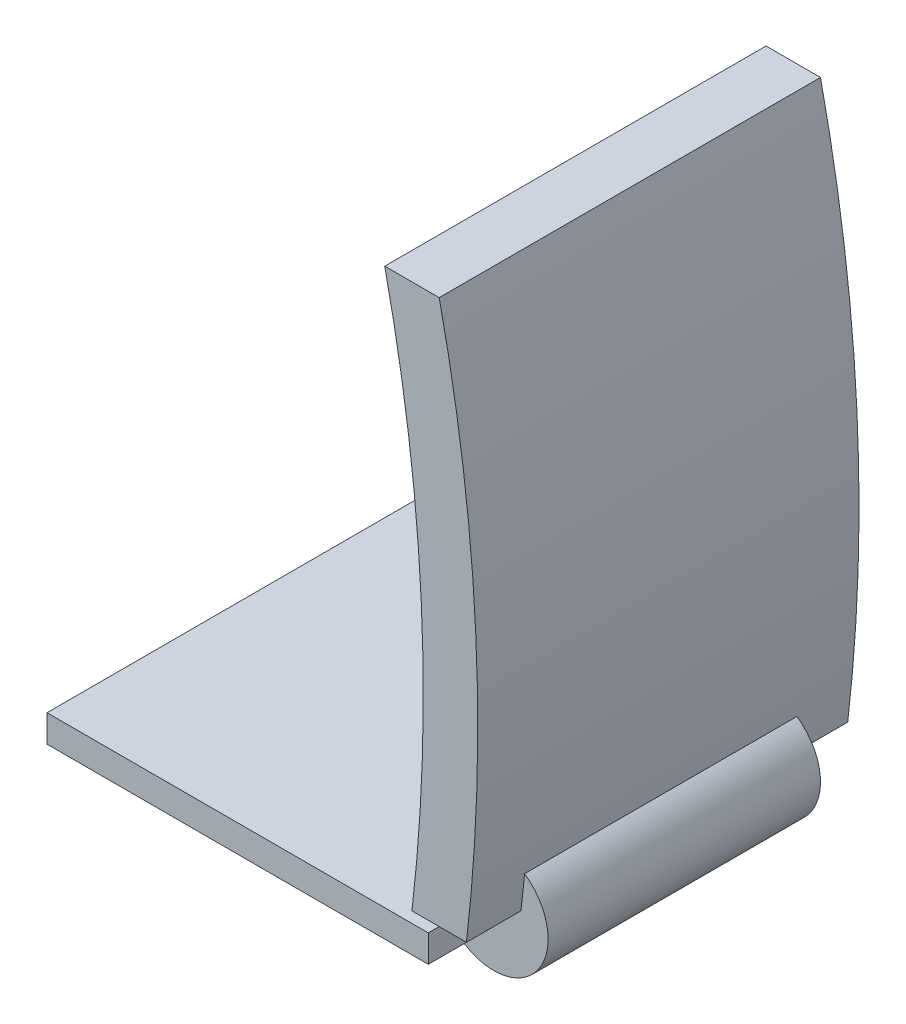
ISO-10303-21;
HEADER;
FILE_DESCRIPTION(('STEP AP214'),'2;1');
FILE_NAME('part.step','',(''),(''),'','','');
FILE_SCHEMA(('AUTOMOTIVE_DESIGN { 1 0 10303 214 1 1 1 1 }'));
ENDSEC;
DATA;
#1=APPLICATION_CONTEXT('core data for automotive mechanical design processes');
#2=APPLICATION_PROTOCOL_DEFINITION('international standard','automotive_design',2000,#1);
#3=PRODUCT_CONTEXT('',#1,'mechanical');
#4=PRODUCT('Part','Part','',(#3));
#5=PRODUCT_RELATED_PRODUCT_CATEGORY('part','',(#4));
#6=PRODUCT_DEFINITION_FORMATION('','',#4);
#7=PRODUCT_DEFINITION_CONTEXT('part definition',#1,'design');
#8=PRODUCT_DEFINITION('design','',#6,#7);
#9=PRODUCT_DEFINITION_SHAPE('','',#8);
#10=(LENGTH_UNIT() NAMED_UNIT(*) SI_UNIT(.MILLI.,.METRE.));
#11=(NAMED_UNIT(*) PLANE_ANGLE_UNIT() SI_UNIT($,.RADIAN.));
#12=(NAMED_UNIT(*) SI_UNIT($,.STERADIAN.) SOLID_ANGLE_UNIT());
#13=UNCERTAINTY_MEASURE_WITH_UNIT(LENGTH_MEASURE(1.E-05),#10,'distance_accuracy_value','');
#14=(GEOMETRIC_REPRESENTATION_CONTEXT(3) GLOBAL_UNCERTAINTY_ASSIGNED_CONTEXT((#13)) GLOBAL_UNIT_ASSIGNED_CONTEXT((#10,
#11,#12)) REPRESENTATION_CONTEXT('',''));
#15=CARTESIAN_POINT('',(0.,0.,0.));
#16=DIRECTION('',(0.,0.,1.));
#17=DIRECTION('',(1.,0.,0.));
#18=AXIS2_PLACEMENT_3D('',#15,#16,#17);
#19=CARTESIAN_POINT('',(-20.,0.,-350.));
#20=DIRECTION('',(-1.,0.,0.));
#21=DIRECTION('',(0.,-1.,0.));
#22=AXIS2_PLACEMENT_3D('',#19,#20,#21);
#23=PLANE('',#22);
#24=DIRECTION('',(0.,-1.,0.));
#25=VECTOR('',#24,1.);
#26=CARTESIAN_POINT('',(-20.,0.,-250.));
#27=LINE('',#26,#25);
#28=CARTESIAN_POINT('',(-20.,0.,-250.));
#29=VERTEX_POINT('',#28);
#30=CARTESIAN_POINT('',(-20.,-50.,-250.));
#31=VERTEX_POINT('',#30);
#32=EDGE_CURVE('E254',#29,#31,#27,.T.);
#33=ORIENTED_EDGE('',*,*,#32,.T.);
#34=DIRECTION('',(0.,0.,1.));
#35=VECTOR('',#34,1.);
#36=CARTESIAN_POINT('',(-20.,-50.,-350.));
#37=LINE('',#36,#35);
#38=CARTESIAN_POINT('',(-20.,-50.,-350.));
#39=VERTEX_POINT('',#38);
#40=EDGE_CURVE('E38',#39,#31,#37,.T.);
#41=ORIENTED_EDGE('',*,*,#40,.F.);
#42=DIRECTION('',(0.,-1.,0.));
#43=VECTOR('',#42,1.);
#44=CARTESIAN_POINT('',(-20.,0.,-350.));
#45=LINE('',#44,#43);
#46=CARTESIAN_POINT('',(-20.,0.,-350.));
#47=VERTEX_POINT('',#46);
#48=EDGE_CURVE('E274',#47,#39,#45,.T.);
#49=ORIENTED_EDGE('',*,*,#48,.F.);
#50=DIRECTION('',(0.,0.,1.));
#51=VECTOR('',#50,1.);
#52=CARTESIAN_POINT('',(-20.,0.,-350.));
#53=LINE('',#52,#51);
#54=EDGE_CURVE('E156',#47,#29,#53,.T.);
#55=ORIENTED_EDGE('',*,*,#54,.T.);
#56=EDGE_LOOP('',(#33,#41,#49,#55));
#57=FACE_BOUND('',#56,.T.);
#58=ADVANCED_FACE('F34',(#57),#23,.F.);
#59=CARTESIAN_POINT('',(0.,-50.,-350.));
#60=DIRECTION('',(0.,1.,0.));
#61=DIRECTION('',(-1.,0.,0.));
#62=AXIS2_PLACEMENT_3D('',#59,#60,#61);
#63=PLANE('',#62);
#64=CARTESIAN_POINT('',(-370.,-50.,0.));
#65=DIRECTION('',(0.,-1.,0.));
#66=DIRECTION('',(1.,0.,0.));
#67=AXIS2_PLACEMENT_3D('',#64,#65,#66);
#68=CIRCLE('',#67,100.);
#69=CARTESIAN_POINT('',(-270.,-50.,0.));
#70=VERTEX_POINT('',#69);
#71=EDGE_CURVE('E172',#70,#70,#68,.T.);
#72=ORIENTED_EDGE('',*,*,#71,.F.);
#73=EDGE_LOOP('',(#72));
#74=FACE_BOUND('',#73,.T.);
#75=DIRECTION('',(-1.,0.,0.));
#76=VECTOR('',#75,1.);
#77=CARTESIAN_POINT('',(0.,-50.,-250.));
#78=LINE('',#77,#76);
#79=CARTESIAN_POINT('',(-86.6025403784439,-50.,-250.));
#80=VERTEX_POINT('',#79);
#81=EDGE_CURVE('E257',#31,#80,#78,.T.);
#82=ORIENTED_EDGE('',*,*,#81,.T.);
#83=DIRECTION('',(0.,0.,1.));
#84=VECTOR('',#83,1.);
#85=CARTESIAN_POINT('',(-86.6025403784439,-50.,-250.));
#86=LINE('',#85,#84);
#87=CARTESIAN_POINT('',(-86.6025403784439,-50.,250.));
#88=VERTEX_POINT('',#87);
#89=EDGE_CURVE('E268',#80,#88,#86,.T.);
#90=ORIENTED_EDGE('',*,*,#89,.T.);
#91=DIRECTION('',(-1.,0.,0.));
#92=VECTOR('',#91,1.);
#93=CARTESIAN_POINT('',(0.,-50.,250.));
#94=LINE('',#93,#92);
#95=CARTESIAN_POINT('',(-20.,-50.,250.));
#96=VERTEX_POINT('',#95);
#97=EDGE_CURVE('E214',#96,#88,#94,.T.);
#98=ORIENTED_EDGE('',*,*,#97,.F.);
#99=DIRECTION('',(0.,0.,-1.));
#100=VECTOR('',#99,1.);
#101=CARTESIAN_POINT('',(-20.,-50.,350.));
#102=LINE('',#101,#100);
#103=CARTESIAN_POINT('',(-20.,-50.,350.));
#104=VERTEX_POINT('',#103);
#105=EDGE_CURVE('E180',#104,#96,#102,.T.);
#106=ORIENTED_EDGE('',*,*,#105,.F.);
#107=DIRECTION('',(-1.,0.,0.));
#108=VECTOR('',#107,1.);
#109=CARTESIAN_POINT('',(0.,-50.,350.));
#110=LINE('',#109,#108);
#111=CARTESIAN_POINT('',(-720.,-50.0000000000001,350.));
#112=VERTEX_POINT('',#111);
#113=EDGE_CURVE('E164',#104,#112,#110,.T.);
#114=ORIENTED_EDGE('',*,*,#113,.T.);
#115=DIRECTION('',(0.,0.,1.));
#116=VECTOR('',#115,1.);
#117=CARTESIAN_POINT('',(-720.,-50.0000000000001,-350.));
#118=LINE('',#117,#116);
#119=CARTESIAN_POINT('',(-720.,-50.0000000000001,-350.));
#120=VERTEX_POINT('',#119);
#121=EDGE_CURVE('E11',#120,#112,#118,.T.);
#122=ORIENTED_EDGE('',*,*,#121,.F.);
#123=DIRECTION('',(-1.,0.,0.));
#124=VECTOR('',#123,1.);
#125=CARTESIAN_POINT('',(0.,-50.,-350.));
#126=LINE('',#125,#124);
#127=EDGE_CURVE('E51',#39,#120,#126,.T.);
#128=ORIENTED_EDGE('',*,*,#127,.F.);
#129=ORIENTED_EDGE('',*,*,#40,.T.);
#130=EDGE_LOOP('',(#82,#90,#98,#106,#114,#122,#128,#129));
#131=FACE_BOUND('',#130,.T.);
#132=ADVANCED_FACE('F36',(#74,#131),#63,.F.);
#133=CARTESIAN_POINT('',(-720.,0.,-350.));
#134=DIRECTION('',(-1.,0.,0.));
#135=DIRECTION('',(0.,0.,1.));
#136=AXIS2_PLACEMENT_3D('',#133,#134,#135);
#137=PLANE('',#136);
#138=ORIENTED_EDGE('',*,*,#121,.T.);
#139=DIRECTION('',(0.,-1.,0.));
#140=VECTOR('',#139,1.);
#141=CARTESIAN_POINT('',(-720.,0.,350.));
#142=LINE('',#141,#140);
#143=CARTESIAN_POINT('',(-720.,0.,350.));
#144=VERTEX_POINT('',#143);
#145=EDGE_CURVE('E159',#144,#112,#142,.T.);
#146=ORIENTED_EDGE('',*,*,#145,.F.);
#147=DIRECTION('',(0.,0.,1.));
#148=VECTOR('',#147,1.);
#149=CARTESIAN_POINT('',(-720.,0.,-350.));
#150=LINE('',#149,#148);
#151=CARTESIAN_POINT('',(-720.,0.,-350.));
#152=VERTEX_POINT('',#151);
#153=EDGE_CURVE('E43',#152,#144,#150,.T.);
#154=ORIENTED_EDGE('',*,*,#153,.F.);
#155=DIRECTION('',(0.,-1.,0.));
#156=VECTOR('',#155,1.);
#157=CARTESIAN_POINT('',(-720.,0.,-350.));
#158=LINE('',#157,#156);
#159=EDGE_CURVE('E277',#152,#120,#158,.T.);
#160=ORIENTED_EDGE('',*,*,#159,.T.);
#161=EDGE_LOOP('',(#138,#146,#154,#160));
#162=FACE_BOUND('',#161,.T.);
#163=ADVANCED_FACE('F160',(#162),#137,.T.);
#164=CARTESIAN_POINT('',(0.,0.,-350.));
#165=DIRECTION('',(0.,1.,0.));
#166=DIRECTION('',(-1.,0.,0.));
#167=AXIS2_PLACEMENT_3D('',#164,#165,#166);
#168=PLANE('',#167);
#169=DIRECTION('',(0.,0.,1.));
#170=VECTOR('',#169,1.);
#171=CARTESIAN_POINT('',(-100.,0.,-250.));
#172=LINE('',#171,#170);
#173=CARTESIAN_POINT('',(-100.,0.,-250.));
#174=VERTEX_POINT('',#173);
#175=CARTESIAN_POINT('',(-100.,0.,250.));
#176=VERTEX_POINT('',#175);
#177=EDGE_CURVE('E270',#174,#176,#172,.T.);
#178=ORIENTED_EDGE('',*,*,#177,.F.);
#179=DIRECTION('',(-1.,0.,0.));
#180=VECTOR('',#179,1.);
#181=CARTESIAN_POINT('',(0.,0.,-250.));
#182=LINE('',#181,#180);
#183=EDGE_CURVE('E252',#29,#174,#182,.T.);
#184=ORIENTED_EDGE('',*,*,#183,.F.);
#185=ORIENTED_EDGE('',*,*,#54,.F.);
#186=DIRECTION('',(-1.,0.,0.));
#187=VECTOR('',#186,1.);
#188=CARTESIAN_POINT('',(0.,0.,-350.));
#189=LINE('',#188,#187);
#190=EDGE_CURVE('E155',#47,#152,#189,.T.);
#191=ORIENTED_EDGE('',*,*,#190,.T.);
#192=ORIENTED_EDGE('',*,*,#153,.T.);
#193=DIRECTION('',(-1.,0.,0.));
#194=VECTOR('',#193,1.);
#195=CARTESIAN_POINT('',(0.,0.,350.));
#196=LINE('',#195,#194);
#197=CARTESIAN_POINT('',(-20.,0.,350.));
#198=VERTEX_POINT('',#197);
#199=EDGE_CURVE('E152',#198,#144,#196,.T.);
#200=ORIENTED_EDGE('',*,*,#199,.F.);
#201=DIRECTION('',(0.,0.,-1.));
#202=VECTOR('',#201,1.);
#203=CARTESIAN_POINT('',(-20.,0.,350.));
#204=LINE('',#203,#202);
#205=CARTESIAN_POINT('',(-20.,0.,250.));
#206=VERTEX_POINT('',#205);
#207=EDGE_CURVE('E178',#198,#206,#204,.T.);
#208=ORIENTED_EDGE('',*,*,#207,.T.);
#209=DIRECTION('',(-1.,0.,0.));
#210=VECTOR('',#209,1.);
#211=CARTESIAN_POINT('',(0.,0.,250.));
#212=LINE('',#211,#210);
#213=EDGE_CURVE('E208',#206,#176,#212,.T.);
#214=ORIENTED_EDGE('',*,*,#213,.T.);
#215=EDGE_LOOP('',(#178,#184,#185,#191,#192,#200,#208,#214));
#216=FACE_BOUND('',#215,.T.);
#217=ADVANCED_FACE('F149',(#216),#168,.T.);
#218=CARTESIAN_POINT('',(0.,0.,-350.));
#219=DIRECTION('',(0.,0.,1.));
#220=DIRECTION('',(1.,0.,0.));
#221=AXIS2_PLACEMENT_3D('',#218,#219,#220);
#222=PLANE('',#221);
#223=ORIENTED_EDGE('',*,*,#127,.T.);
#224=ORIENTED_EDGE('',*,*,#159,.F.);
#225=ORIENTED_EDGE('',*,*,#190,.F.);
#226=ORIENTED_EDGE('',*,*,#48,.T.);
#227=EDGE_LOOP('',(#223,#224,#225,#226));
#228=FACE_BOUND('',#227,.T.);
#229=ADVANCED_FACE('F318',(#228),#222,.F.);
#230=CARTESIAN_POINT('',(0.,0.,-250.));
#231=DIRECTION('',(0.,0.,1.));
#232=DIRECTION('',(1.,0.,0.));
#233=AXIS2_PLACEMENT_3D('',#230,#231,#232);
#234=CYLINDRICAL_SURFACE('',#233,100.);
#235=DIRECTION('',(0.,0.,1.));
#236=VECTOR('',#235,1.);
#237=CARTESIAN_POINT('',(56.7139128609186,82.3622006020113,-250.));
#238=LINE('',#237,#236);
#239=CARTESIAN_POINT('',(56.7139128609186,82.3622006020113,-250.));
#240=VERTEX_POINT('',#239);
#241=CARTESIAN_POINT('',(56.7139128609175,82.3622006020011,250.));
#242=VERTEX_POINT('',#241);
#243=EDGE_CURVE('E266',#240,#242,#238,.T.);
#244=ORIENTED_EDGE('',*,*,#243,.T.);
#245=CARTESIAN_POINT('',(0.,0.,250.));
#246=DIRECTION('',(0.,0.,1.));
#247=DIRECTION('',(1.,0.,0.));
#248=AXIS2_PLACEMENT_3D('',#245,#246,#247);
#249=CIRCLE('',#248,100.);
#250=EDGE_CURVE('E217',#88,#242,#249,.T.);
#251=ORIENTED_EDGE('',*,*,#250,.F.);
#252=ORIENTED_EDGE('',*,*,#89,.F.);
#253=CARTESIAN_POINT('',(0.,0.,-250.));
#254=DIRECTION('',(0.,0.,1.));
#255=DIRECTION('',(1.,0.,0.));
#256=AXIS2_PLACEMENT_3D('',#253,#254,#255);
#257=CIRCLE('',#256,100.);
#258=EDGE_CURVE('E260',#80,#240,#257,.T.);
#259=ORIENTED_EDGE('',*,*,#258,.T.);
#260=EDGE_LOOP('',(#244,#251,#252,#259));
#261=FACE_BOUND('',#260,.T.);
#262=ADVANCED_FACE('F311',(#261),#234,.T.);
#263=CARTESIAN_POINT('',(0.,0.,-250.));
#264=DIRECTION('',(0.,0.,1.));
#265=DIRECTION('',(1.,0.,0.));
#266=AXIS2_PLACEMENT_3D('',#263,#264,#265);
#267=CYLINDRICAL_SURFACE('',#266,100.);
#268=ORIENTED_EDGE('',*,*,#177,.T.);
#269=CARTESIAN_POINT('',(0.,0.,250.));
#270=DIRECTION('',(0.,0.,1.));
#271=DIRECTION('',(1.,0.,0.));
#272=AXIS2_PLACEMENT_3D('',#269,#270,#271);
#273=CIRCLE('',#272,100.);
#274=CARTESIAN_POINT('',(-42.5055489531823,90.5167294382122,250.));
#275=VERTEX_POINT('',#274);
#276=EDGE_CURVE('E205',#275,#176,#273,.T.);
#277=ORIENTED_EDGE('',*,*,#276,.F.);
#278=DIRECTION('',(0.,0.,1.));
#279=VECTOR('',#278,1.);
#280=CARTESIAN_POINT('',(-42.5055489531823,90.5167294382122,-250.));
#281=LINE('',#280,#279);
#282=CARTESIAN_POINT('',(-42.5055489531834,90.5167294382013,-250.));
#283=VERTEX_POINT('',#282);
#284=EDGE_CURVE('E265',#283,#275,#281,.T.);
#285=ORIENTED_EDGE('',*,*,#284,.F.);
#286=CARTESIAN_POINT('',(0.,0.,-250.));
#287=DIRECTION('',(0.,0.,1.));
#288=DIRECTION('',(1.,0.,0.));
#289=AXIS2_PLACEMENT_3D('',#286,#287,#288);
#290=CIRCLE('',#289,100.);
#291=EDGE_CURVE('E249',#283,#174,#290,.T.);
#292=ORIENTED_EDGE('',*,*,#291,.T.);
#293=EDGE_LOOP('',(#268,#277,#285,#292));
#294=FACE_BOUND('',#293,.T.);
#295=ADVANCED_FACE('F291',(#294),#267,.T.);
#296=CARTESIAN_POINT('',(0.,0.,-250.));
#297=DIRECTION('',(0.,0.,1.));
#298=DIRECTION('',(1.,0.,0.));
#299=AXIS2_PLACEMENT_3D('',#296,#297,#298);
#300=PLANE('',#299);
#301=DIRECTION('',(-1.,0.,0.));
#302=VECTOR('',#301,1.);
#303=CARTESIAN_POINT('',(0.,20.,-250.));
#304=LINE('',#303,#302);
#305=CARTESIAN_POINT('',(50.,20.,-250.));
#306=VERTEX_POINT('',#305);
#307=CARTESIAN_POINT('',(-50.,20.,-250.));
#308=VERTEX_POINT('',#307);
#309=EDGE_CURVE('E243',#306,#308,#304,.T.);
#310=ORIENTED_EDGE('',*,*,#309,.F.);
#311=CARTESIAN_POINT('',(-2929.24374582154,372.287812708923,-250.));
#312=DIRECTION('',(0.,0.,1.));
#313=DIRECTION('',(1.,0.,0.));
#314=AXIS2_PLACEMENT_3D('',#311,#312,#313);
#315=CIRCLE('',#314,3000.);
#316=EDGE_CURVE('E263',#306,#240,#315,.T.);
#317=ORIENTED_EDGE('',*,*,#316,.T.);
#318=ORIENTED_EDGE('',*,*,#258,.F.);
#319=ORIENTED_EDGE('',*,*,#81,.F.);
#320=ORIENTED_EDGE('',*,*,#32,.F.);
#321=ORIENTED_EDGE('',*,*,#183,.T.);
#322=ORIENTED_EDGE('',*,*,#291,.F.);
#323=CARTESIAN_POINT('',(-3029.24374582154,372.287812708923,-250.));
#324=DIRECTION('',(0.,0.,1.));
#325=DIRECTION('',(1.,0.,0.));
#326=AXIS2_PLACEMENT_3D('',#323,#324,#325);
#327=CIRCLE('',#326,3000.);
#328=EDGE_CURVE('E246',#308,#283,#327,.T.);
#329=ORIENTED_EDGE('',*,*,#328,.F.);
#330=EDGE_LOOP('',(#310,#317,#318,#319,#320,#321,#322,#329));
#331=FACE_BOUND('',#330,.T.);
#332=ADVANCED_FACE('F286',(#331),#300,.F.);
#333=CARTESIAN_POINT('',(50.,20.,-350.));
#334=DIRECTION('',(0.,1.,0.));
#335=DIRECTION('',(-1.,0.,0.));
#336=AXIS2_PLACEMENT_3D('',#333,#334,#335);
#337=PLANE('',#336);
#338=DIRECTION('',(0.,0.,1.));
#339=VECTOR('',#338,1.);
#340=CARTESIAN_POINT('',(50.,20.,-350.));
#341=LINE('',#340,#339);
#342=CARTESIAN_POINT('',(50.,20.,-350.));
#343=VERTEX_POINT('',#342);
#344=EDGE_CURVE('E223',#343,#306,#341,.T.);
#345=ORIENTED_EDGE('',*,*,#344,.T.);
#346=ORIENTED_EDGE('',*,*,#309,.T.);
#347=DIRECTION('',(0.,0.,1.));
#348=VECTOR('',#347,1.);
#349=CARTESIAN_POINT('',(-50.0000000000003,19.9999999999985,-350.));
#350=LINE('',#349,#348);
#351=CARTESIAN_POINT('',(-50.0000000000003,19.9999999999985,-350.));
#352=VERTEX_POINT('',#351);
#353=EDGE_CURVE('E229',#352,#308,#350,.T.);
#354=ORIENTED_EDGE('',*,*,#353,.F.);
#355=DIRECTION('',(-1.,0.,0.));
#356=VECTOR('',#355,1.);
#357=CARTESIAN_POINT('',(50.,20.,-350.));
#358=LINE('',#357,#356);
#359=EDGE_CURVE('E226',#343,#352,#358,.T.);
#360=ORIENTED_EDGE('',*,*,#359,.F.);
#361=EDGE_LOOP('',(#345,#346,#354,#360));
#362=FACE_BOUND('',#361,.T.);
#363=ADVANCED_FACE('F297',(#362),#337,.F.);
#364=CARTESIAN_POINT('',(-2929.24374582154,372.287812708923,-350.));
#365=DIRECTION('',(0.,0.,1.));
#366=DIRECTION('',(1.,0.,0.));
#367=AXIS2_PLACEMENT_3D('',#364,#365,#366);
#368=CYLINDRICAL_SURFACE('',#367,3000.);
#369=DIRECTION('',(0.,0.,1.));
#370=VECTOR('',#369,1.);
#371=CARTESIAN_POINT('',(0.,1020.,-350.));
#372=LINE('',#371,#370);
#373=CARTESIAN_POINT('',(0.,1020.,-350.));
#374=VERTEX_POINT('',#373);
#375=CARTESIAN_POINT('',(0.,1020.,350.));
#376=VERTEX_POINT('',#375);
#377=EDGE_CURVE('E224',#374,#376,#372,.T.);
#378=ORIENTED_EDGE('',*,*,#377,.T.);
#379=CARTESIAN_POINT('',(-2929.24374582154,372.287812708923,350.));
#380=DIRECTION('',(0.,0.,1.));
#381=DIRECTION('',(1.,0.,0.));
#382=AXIS2_PLACEMENT_3D('',#379,#380,#381);
#383=CIRCLE('',#382,3000.);
#384=CARTESIAN_POINT('',(50.,20.,350.));
#385=VERTEX_POINT('',#384);
#386=EDGE_CURVE('E188',#385,#376,#383,.T.);
#387=ORIENTED_EDGE('',*,*,#386,.F.);
#388=DIRECTION('',(0.,0.,-1.));
#389=VECTOR('',#388,1.);
#390=CARTESIAN_POINT('',(50.,20.,350.));
#391=LINE('',#390,#389);
#392=CARTESIAN_POINT('',(50.,20.,250.));
#393=VERTEX_POINT('',#392);
#394=EDGE_CURVE('E194',#385,#393,#391,.T.);
#395=ORIENTED_EDGE('',*,*,#394,.T.);
#396=CARTESIAN_POINT('',(-2929.24374582154,372.287812708923,250.));
#397=DIRECTION('',(0.,0.,1.));
#398=DIRECTION('',(1.,0.,0.));
#399=AXIS2_PLACEMENT_3D('',#396,#397,#398);
#400=CIRCLE('',#399,3000.);
#401=EDGE_CURVE('E220',#393,#242,#400,.T.);
#402=ORIENTED_EDGE('',*,*,#401,.T.);
#403=ORIENTED_EDGE('',*,*,#243,.F.);
#404=ORIENTED_EDGE('',*,*,#316,.F.);
#405=ORIENTED_EDGE('',*,*,#344,.F.);
#406=CARTESIAN_POINT('',(-2929.24374582154,372.287812708923,-350.));
#407=DIRECTION('',(0.,0.,1.));
#408=DIRECTION('',(1.,0.,0.));
#409=AXIS2_PLACEMENT_3D('',#406,#407,#408);
#410=CIRCLE('',#409,3000.);
#411=EDGE_CURVE('E240',#343,#374,#410,.T.);
#412=ORIENTED_EDGE('',*,*,#411,.T.);
#413=EDGE_LOOP('',(#378,#387,#395,#402,#403,#404,#405,#412));
#414=FACE_BOUND('',#413,.T.);
#415=ADVANCED_FACE('F307',(#414),#368,.T.);
#416=CARTESIAN_POINT('',(-3029.24374582154,372.287812708923,-350.));
#417=DIRECTION('',(0.,0.,1.));
#418=DIRECTION('',(1.,0.,0.));
#419=AXIS2_PLACEMENT_3D('',#416,#417,#418);
#420=CYLINDRICAL_SURFACE('',#419,3000.);
#421=ORIENTED_EDGE('',*,*,#284,.T.);
#422=CARTESIAN_POINT('',(-3029.24374582154,372.287812708923,250.));
#423=DIRECTION('',(0.,0.,1.));
#424=DIRECTION('',(1.,0.,0.));
#425=AXIS2_PLACEMENT_3D('',#422,#423,#424);
#426=CIRCLE('',#425,3000.);
#427=CARTESIAN_POINT('',(-50.,20.,250.));
#428=VERTEX_POINT('',#427);
#429=EDGE_CURVE('E202',#428,#275,#426,.T.);
#430=ORIENTED_EDGE('',*,*,#429,.F.);
#431=DIRECTION('',(0.,0.,-1.));
#432=VECTOR('',#431,1.);
#433=CARTESIAN_POINT('',(-50.,20.,350.));
#434=LINE('',#433,#432);
#435=CARTESIAN_POINT('',(-50.,20.,350.));
#436=VERTEX_POINT('',#435);
#437=EDGE_CURVE('E197',#436,#428,#434,.T.);
#438=ORIENTED_EDGE('',*,*,#437,.F.);
#439=CARTESIAN_POINT('',(-3029.24374582154,372.287812708923,350.));
#440=DIRECTION('',(0.,0.,1.));
#441=DIRECTION('',(1.,0.,0.));
#442=AXIS2_PLACEMENT_3D('',#439,#440,#441);
#443=CIRCLE('',#442,3000.);
#444=CARTESIAN_POINT('',(-100.,1020.,350.));
#445=VERTEX_POINT('',#444);
#446=EDGE_CURVE('E182',#436,#445,#443,.T.);
#447=ORIENTED_EDGE('',*,*,#446,.T.);
#448=DIRECTION('',(0.,0.,1.));
#449=VECTOR('',#448,1.);
#450=CARTESIAN_POINT('',(-100.,1020.,-350.));
#451=LINE('',#450,#449);
#452=CARTESIAN_POINT('',(-100.,1020.,-350.));
#453=VERTEX_POINT('',#452);
#454=EDGE_CURVE('E227',#453,#445,#451,.T.);
#455=ORIENTED_EDGE('',*,*,#454,.F.);
#456=CARTESIAN_POINT('',(-3029.24374582154,372.287812708923,-350.));
#457=DIRECTION('',(0.,0.,1.));
#458=DIRECTION('',(1.,0.,0.));
#459=AXIS2_PLACEMENT_3D('',#456,#457,#458);
#460=CIRCLE('',#459,3000.);
#461=EDGE_CURVE('E235',#352,#453,#460,.T.);
#462=ORIENTED_EDGE('',*,*,#461,.F.);
#463=ORIENTED_EDGE('',*,*,#353,.T.);
#464=ORIENTED_EDGE('',*,*,#328,.T.);
#465=EDGE_LOOP('',(#421,#430,#438,#447,#455,#462,#463,#464));
#466=FACE_BOUND('',#465,.T.);
#467=ADVANCED_FACE('F300',(#466),#420,.F.);
#468=CARTESIAN_POINT('',(-50.,1020.,-350.));
#469=DIRECTION('',(0.,1.,0.));
#470=DIRECTION('',(0.,0.,1.));
#471=AXIS2_PLACEMENT_3D('',#468,#469,#470);
#472=PLANE('',#471);
#473=ORIENTED_EDGE('',*,*,#454,.T.);
#474=DIRECTION('',(-1.,0.,0.));
#475=VECTOR('',#474,1.);
#476=CARTESIAN_POINT('',(0.,1020.,350.));
#477=LINE('',#476,#475);
#478=EDGE_CURVE('E191',#376,#445,#477,.T.);
#479=ORIENTED_EDGE('',*,*,#478,.F.);
#480=ORIENTED_EDGE('',*,*,#377,.F.);
#481=DIRECTION('',(-1.,0.,0.));
#482=VECTOR('',#481,1.);
#483=CARTESIAN_POINT('',(0.,1020.,-350.));
#484=LINE('',#483,#482);
#485=EDGE_CURVE('E238',#374,#453,#484,.T.);
#486=ORIENTED_EDGE('',*,*,#485,.T.);
#487=EDGE_LOOP('',(#473,#479,#480,#486));
#488=FACE_BOUND('',#487,.T.);
#489=ADVANCED_FACE('F382',(#488),#472,.T.);
#490=CARTESIAN_POINT('',(-2929.24374582154,372.287812708923,-350.));
#491=DIRECTION('',(0.,0.,1.));
#492=DIRECTION('',(1.,0.,0.));
#493=AXIS2_PLACEMENT_3D('',#490,#491,#492);
#494=PLANE('',#493);
#495=ORIENTED_EDGE('',*,*,#411,.F.);
#496=ORIENTED_EDGE('',*,*,#359,.T.);
#497=ORIENTED_EDGE('',*,*,#461,.T.);
#498=ORIENTED_EDGE('',*,*,#485,.F.);
#499=EDGE_LOOP('',(#495,#496,#497,#498));
#500=FACE_BOUND('',#499,.T.);
#501=ADVANCED_FACE('F305',(#500),#494,.F.);
#502=CARTESIAN_POINT('',(0.,0.,250.));
#503=DIRECTION('',(0.,0.,1.));
#504=DIRECTION('',(1.,0.,0.));
#505=AXIS2_PLACEMENT_3D('',#502,#503,#504);
#506=PLANE('',#505);
#507=DIRECTION('',(-1.,0.,0.));
#508=VECTOR('',#507,1.);
#509=CARTESIAN_POINT('',(0.,20.,250.));
#510=LINE('',#509,#508);
#511=EDGE_CURVE('E200',#393,#428,#510,.T.);
#512=ORIENTED_EDGE('',*,*,#511,.T.);
#513=ORIENTED_EDGE('',*,*,#429,.T.);
#514=ORIENTED_EDGE('',*,*,#276,.T.);
#515=ORIENTED_EDGE('',*,*,#213,.F.);
#516=DIRECTION('',(0.,-1.,0.));
#517=VECTOR('',#516,1.);
#518=CARTESIAN_POINT('',(-20.,0.,250.));
#519=LINE('',#518,#517);
#520=EDGE_CURVE('E211',#206,#96,#519,.T.);
#521=ORIENTED_EDGE('',*,*,#520,.T.);
#522=ORIENTED_EDGE('',*,*,#97,.T.);
#523=ORIENTED_EDGE('',*,*,#250,.T.);
#524=ORIENTED_EDGE('',*,*,#401,.F.);
#525=EDGE_LOOP('',(#512,#513,#514,#515,#521,#522,#523,#524));
#526=FACE_BOUND('',#525,.T.);
#527=ADVANCED_FACE('F315',(#526),#506,.T.);
#528=CARTESIAN_POINT('',(0.,20.,350.));
#529=DIRECTION('',(0.,-1.,0.));
#530=DIRECTION('',(1.,0.,0.));
#531=AXIS2_PLACEMENT_3D('',#528,#529,#530);
#532=PLANE('',#531);
#533=ORIENTED_EDGE('',*,*,#437,.T.);
#534=ORIENTED_EDGE('',*,*,#511,.F.);
#535=ORIENTED_EDGE('',*,*,#394,.F.);
#536=DIRECTION('',(-1.,0.,0.));
#537=VECTOR('',#536,1.);
#538=CARTESIAN_POINT('',(0.,20.,350.));
#539=LINE('',#538,#537);
#540=EDGE_CURVE('E185',#385,#436,#539,.T.);
#541=ORIENTED_EDGE('',*,*,#540,.T.);
#542=EDGE_LOOP('',(#533,#534,#535,#541));
#543=FACE_BOUND('',#542,.T.);
#544=ADVANCED_FACE('F404',(#543),#532,.T.);
#545=CARTESIAN_POINT('',(0.,0.,350.));
#546=DIRECTION('',(0.,0.,1.));
#547=DIRECTION('',(1.,0.,0.));
#548=AXIS2_PLACEMENT_3D('',#545,#546,#547);
#549=PLANE('',#548);
#550=ORIENTED_EDGE('',*,*,#446,.F.);
#551=ORIENTED_EDGE('',*,*,#540,.F.);
#552=ORIENTED_EDGE('',*,*,#386,.T.);
#553=ORIENTED_EDGE('',*,*,#478,.T.);
#554=EDGE_LOOP('',(#550,#551,#552,#553));
#555=FACE_BOUND('',#554,.T.);
#556=ADVANCED_FACE('F413',(#555),#549,.T.);
#557=CARTESIAN_POINT('',(-20.,0.,350.));
#558=DIRECTION('',(1.,0.,0.));
#559=DIRECTION('',(0.,1.,0.));
#560=AXIS2_PLACEMENT_3D('',#557,#558,#559);
#561=PLANE('',#560);
#562=ORIENTED_EDGE('',*,*,#105,.T.);
#563=ORIENTED_EDGE('',*,*,#520,.F.);
#564=ORIENTED_EDGE('',*,*,#207,.F.);
#565=DIRECTION('',(0.,-1.,0.));
#566=VECTOR('',#565,1.);
#567=CARTESIAN_POINT('',(-20.,0.,350.));
#568=LINE('',#567,#566);
#569=EDGE_CURVE('E168',#198,#104,#568,.T.);
#570=ORIENTED_EDGE('',*,*,#569,.T.);
#571=EDGE_LOOP('',(#562,#563,#564,#570));
#572=FACE_BOUND('',#571,.T.);
#573=ADVANCED_FACE('F317',(#572),#561,.T.);
#574=CARTESIAN_POINT('',(0.,0.,350.));
#575=DIRECTION('',(0.,0.,1.));
#576=DIRECTION('',(1.,0.,0.));
#577=AXIS2_PLACEMENT_3D('',#574,#575,#576);
#578=PLANE('',#577);
#579=ORIENTED_EDGE('',*,*,#199,.T.);
#580=ORIENTED_EDGE('',*,*,#145,.T.);
#581=ORIENTED_EDGE('',*,*,#113,.F.);
#582=ORIENTED_EDGE('',*,*,#569,.F.);
#583=EDGE_LOOP('',(#579,#580,#581,#582));
#584=FACE_BOUND('',#583,.T.);
#585=ADVANCED_FACE('F166',(#584),#578,.T.);
#586=CARTESIAN_POINT('',(-370.,-25.,0.));
#587=DIRECTION('',(0.,-1.,0.));
#588=DIRECTION('',(1.,0.,0.));
#589=AXIS2_PLACEMENT_3D('',#586,#587,#588);
#590=CYLINDRICAL_SURFACE('',#589,100.);
#591=CARTESIAN_POINT('',(-370.,-25.,0.));
#592=DIRECTION('',(0.,-1.,0.));
#593=DIRECTION('',(1.,0.,0.));
#594=AXIS2_PLACEMENT_3D('',#591,#592,#593);
#595=CIRCLE('',#594,100.);
#596=CARTESIAN_POINT('',(-270.,-25.,0.));
#597=VERTEX_POINT('',#596);
#598=EDGE_CURVE('E169',#597,#597,#595,.T.);
#599=ORIENTED_EDGE('',*,*,#598,.F.);
#600=EDGE_LOOP('',(#599));
#601=FACE_BOUND('',#600,.T.);
#602=ORIENTED_EDGE('',*,*,#71,.T.);
#603=EDGE_LOOP('',(#602));
#604=FACE_BOUND('',#603,.T.);
#605=ADVANCED_FACE('F442',(#601,#604),#590,.F.);
#606=CARTESIAN_POINT('',(-370.,-25.,0.));
#607=DIRECTION('',(0.,-1.,0.));
#608=DIRECTION('',(1.,0.,0.));
#609=AXIS2_PLACEMENT_3D('',#606,#607,#608);
#610=PLANE('',#609);
#611=ORIENTED_EDGE('',*,*,#598,.T.);
#612=EDGE_LOOP('',(#611));
#613=FACE_BOUND('',#612,.T.);
#614=ADVANCED_FACE('F456',(#613),#610,.T.);
#615=CLOSED_SHELL('',(#58,#132,#163,#217,#229,#262,#295,#332,#363,#415,#467,#489,#501,#527,#544,
#556,#573,#585,#605,#614));
#616=MANIFOLD_SOLID_BREP('B2',#615);
#617=ADVANCED_BREP_SHAPE_REPRESENTATION('',(#18,#616),#14);
#618=SHAPE_DEFINITION_REPRESENTATION(#9,#617);
ENDSEC;
END-ISO-10303-21;
